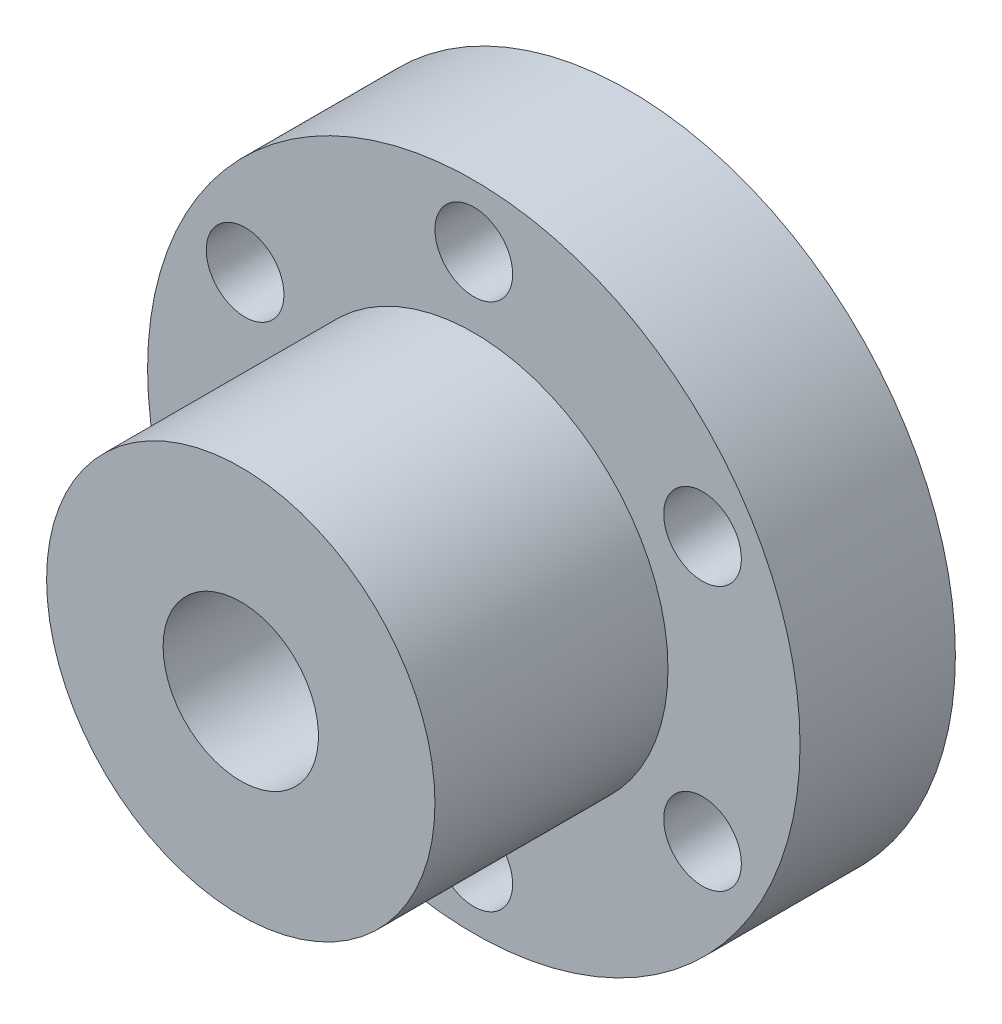
ISO-10303-21;
HEADER;
FILE_DESCRIPTION(('STEP AP214'),'2;1');
FILE_NAME('part.step','',(''),(''),'','','');
FILE_SCHEMA(('AUTOMOTIVE_DESIGN { 1 0 10303 214 1 1 1 1 }'));
ENDSEC;
DATA;
#1=APPLICATION_CONTEXT('core data for automotive mechanical design processes');
#2=APPLICATION_PROTOCOL_DEFINITION('international standard','automotive_design',2000,#1);
#3=PRODUCT_CONTEXT('',#1,'mechanical');
#4=PRODUCT('Part','Part','',(#3));
#5=PRODUCT_RELATED_PRODUCT_CATEGORY('part','',(#4));
#6=PRODUCT_DEFINITION_FORMATION('','',#4);
#7=PRODUCT_DEFINITION_CONTEXT('part definition',#1,'design');
#8=PRODUCT_DEFINITION('design','',#6,#7);
#9=PRODUCT_DEFINITION_SHAPE('','',#8);
#10=(LENGTH_UNIT() NAMED_UNIT(*) SI_UNIT(.MILLI.,.METRE.));
#11=(NAMED_UNIT(*) PLANE_ANGLE_UNIT() SI_UNIT($,.RADIAN.));
#12=(NAMED_UNIT(*) SI_UNIT($,.STERADIAN.) SOLID_ANGLE_UNIT());
#13=UNCERTAINTY_MEASURE_WITH_UNIT(LENGTH_MEASURE(1.E-05),#10,'distance_accuracy_value','');
#14=(GEOMETRIC_REPRESENTATION_CONTEXT(3) GLOBAL_UNCERTAINTY_ASSIGNED_CONTEXT((#13)) GLOBAL_UNIT_ASSIGNED_CONTEXT((#10,
#11,#12)) REPRESENTATION_CONTEXT('',''));
#15=CARTESIAN_POINT('',(0.,0.,0.));
#16=DIRECTION('',(0.,0.,1.));
#17=DIRECTION('',(1.,0.,0.));
#18=AXIS2_PLACEMENT_3D('',#15,#16,#17);
#19=CARTESIAN_POINT('',(0.,0.,10.));
#20=DIRECTION('',(0.,0.,-1.));
#21=DIRECTION('',(-1.,0.,0.));
#22=AXIS2_PLACEMENT_3D('',#19,#20,#21);
#23=CYLINDRICAL_SURFACE('',#22,21.);
#24=CARTESIAN_POINT('',(0.,0.,10.));
#25=DIRECTION('',(0.,0.,1.));
#26=DIRECTION('',(1.,0.,0.));
#27=AXIS2_PLACEMENT_3D('',#24,#25,#26);
#28=CIRCLE('',#27,21.);
#29=CARTESIAN_POINT('',(21.,0.,10.));
#30=VERTEX_POINT('',#29);
#31=EDGE_CURVE('E39',#30,#30,#28,.T.);
#32=ORIENTED_EDGE('',*,*,#31,.F.);
#33=EDGE_LOOP('',(#32));
#34=FACE_BOUND('',#33,.T.);
#35=CARTESIAN_POINT('',(0.,0.,0.));
#36=DIRECTION('',(0.,0.,1.));
#37=DIRECTION('',(1.,0.,0.));
#38=AXIS2_PLACEMENT_3D('',#35,#36,#37);
#39=CIRCLE('',#38,21.);
#40=CARTESIAN_POINT('',(21.,0.,0.));
#41=VERTEX_POINT('',#40);
#42=EDGE_CURVE('E44',#41,#41,#39,.T.);
#43=ORIENTED_EDGE('',*,*,#42,.T.);
#44=EDGE_LOOP('',(#43));
#45=FACE_BOUND('',#44,.T.);
#46=ADVANCED_FACE('F32',(#34,#45),#23,.T.);
#47=CARTESIAN_POINT('',(0.,0.,10.));
#48=DIRECTION('',(0.,0.,1.));
#49=DIRECTION('',(1.,0.,0.));
#50=AXIS2_PLACEMENT_3D('',#47,#48,#49);
#51=PLANE('',#50);
#52=CARTESIAN_POINT('',(-14.7224318643354,8.50000000000017,10.));
#53=DIRECTION('',(0.,0.,1.));
#54=DIRECTION('',(1.,0.,0.));
#55=AXIS2_PLACEMENT_3D('',#52,#53,#54);
#56=CIRCLE('',#55,2.5);
#57=CARTESIAN_POINT('',(-12.2224318643354,8.50000000000017,10.));
#58=VERTEX_POINT('',#57);
#59=EDGE_CURVE('E90',#58,#58,#56,.T.);
#60=ORIENTED_EDGE('',*,*,#59,.F.);
#61=EDGE_LOOP('',(#60));
#62=FACE_BOUND('',#61,.T.);
#63=CARTESIAN_POINT('',(-14.7224318643355,-8.49999999999986,10.));
#64=DIRECTION('',(0.,0.,1.));
#65=DIRECTION('',(1.,0.,0.));
#66=AXIS2_PLACEMENT_3D('',#63,#64,#65);
#67=CIRCLE('',#66,2.5);
#68=CARTESIAN_POINT('',(-12.2224318643355,-8.49999999999986,10.));
#69=VERTEX_POINT('',#68);
#70=EDGE_CURVE('E84',#69,#69,#67,.T.);
#71=ORIENTED_EDGE('',*,*,#70,.F.);
#72=EDGE_LOOP('',(#71));
#73=FACE_BOUND('',#72,.T.);
#74=CARTESIAN_POINT('',(0.,-17.,10.));
#75=DIRECTION('',(0.,0.,1.));
#76=DIRECTION('',(1.,0.,0.));
#77=AXIS2_PLACEMENT_3D('',#74,#75,#76);
#78=CIRCLE('',#77,2.5);
#79=CARTESIAN_POINT('',(2.5,-17.,10.));
#80=VERTEX_POINT('',#79);
#81=EDGE_CURVE('E78',#80,#80,#78,.T.);
#82=ORIENTED_EDGE('',*,*,#81,.F.);
#83=EDGE_LOOP('',(#82));
#84=FACE_BOUND('',#83,.T.);
#85=CARTESIAN_POINT('',(14.7224318643354,-8.50000000000007,10.));
#86=DIRECTION('',(0.,0.,1.));
#87=DIRECTION('',(1.,0.,0.));
#88=AXIS2_PLACEMENT_3D('',#85,#86,#87);
#89=CIRCLE('',#88,2.5);
#90=CARTESIAN_POINT('',(17.2224318643354,-8.50000000000007,10.));
#91=VERTEX_POINT('',#90);
#92=EDGE_CURVE('E72',#91,#91,#89,.T.);
#93=ORIENTED_EDGE('',*,*,#92,.F.);
#94=EDGE_LOOP('',(#93));
#95=FACE_BOUND('',#94,.T.);
#96=CARTESIAN_POINT('',(14.7224318643355,8.49999999999997,10.));
#97=DIRECTION('',(0.,0.,1.));
#98=DIRECTION('',(1.,0.,0.));
#99=AXIS2_PLACEMENT_3D('',#96,#97,#98);
#100=CIRCLE('',#99,2.5);
#101=CARTESIAN_POINT('',(17.2224318643355,8.49999999999997,10.));
#102=VERTEX_POINT('',#101);
#103=EDGE_CURVE('E66',#102,#102,#100,.T.);
#104=ORIENTED_EDGE('',*,*,#103,.F.);
#105=EDGE_LOOP('',(#104));
#106=FACE_BOUND('',#105,.T.);
#107=CARTESIAN_POINT('',(0.,17.,10.));
#108=DIRECTION('',(0.,0.,1.));
#109=DIRECTION('',(1.,0.,0.));
#110=AXIS2_PLACEMENT_3D('',#107,#108,#109);
#111=CIRCLE('',#110,2.5);
#112=CARTESIAN_POINT('',(2.5,17.,10.));
#113=VERTEX_POINT('',#112);
#114=EDGE_CURVE('E57',#113,#113,#111,.T.);
#115=ORIENTED_EDGE('',*,*,#114,.F.);
#116=EDGE_LOOP('',(#115));
#117=FACE_BOUND('',#116,.T.);
#118=CARTESIAN_POINT('',(0.,0.,10.));
#119=DIRECTION('',(0.,0.,1.));
#120=DIRECTION('',(1.,0.,0.));
#121=AXIS2_PLACEMENT_3D('',#118,#119,#120);
#122=CIRCLE('',#121,12.5);
#123=CARTESIAN_POINT('',(12.5,0.,10.));
#124=VERTEX_POINT('',#123);
#125=EDGE_CURVE('E10',#124,#124,#122,.T.);
#126=ORIENTED_EDGE('',*,*,#125,.F.);
#127=EDGE_LOOP('',(#126));
#128=FACE_BOUND('',#127,.T.);
#129=ORIENTED_EDGE('',*,*,#31,.T.);
#130=EDGE_LOOP('',(#129));
#131=FACE_BOUND('',#130,.T.);
#132=ADVANCED_FACE('F113',(#62,#73,#84,#95,#106,#117,#128,#131),#51,.T.);
#133=CARTESIAN_POINT('',(0.,0.,0.));
#134=DIRECTION('',(0.,0.,1.));
#135=DIRECTION('',(1.,0.,0.));
#136=AXIS2_PLACEMENT_3D('',#133,#134,#135);
#137=PLANE('',#136);
#138=CARTESIAN_POINT('',(0.,0.,0.));
#139=DIRECTION('',(0.,0.,1.));
#140=DIRECTION('',(1.,0.,0.));
#141=AXIS2_PLACEMENT_3D('',#138,#139,#140);
#142=CIRCLE('',#141,5.);
#143=CARTESIAN_POINT('',(-5.,0.,0.));
#144=VERTEX_POINT('',#143);
#145=EDGE_CURVE('E93',#144,#144,#142,.F.);
#146=ORIENTED_EDGE('',*,*,#145,.F.);
#147=EDGE_LOOP('',(#146));
#148=FACE_BOUND('',#147,.T.);
#149=CARTESIAN_POINT('',(-14.7224318643354,8.50000000000017,0.));
#150=DIRECTION('',(0.,0.,1.));
#151=DIRECTION('',(1.,0.,0.));
#152=AXIS2_PLACEMENT_3D('',#149,#150,#151);
#153=CIRCLE('',#152,2.5);
#154=CARTESIAN_POINT('',(-12.2224318643354,8.50000000000017,0.));
#155=VERTEX_POINT('',#154);
#156=EDGE_CURVE('E87',#155,#155,#153,.T.);
#157=ORIENTED_EDGE('',*,*,#156,.T.);
#158=EDGE_LOOP('',(#157));
#159=FACE_BOUND('',#158,.T.);
#160=CARTESIAN_POINT('',(-14.7224318643355,-8.49999999999986,0.));
#161=DIRECTION('',(0.,0.,1.));
#162=DIRECTION('',(1.,0.,0.));
#163=AXIS2_PLACEMENT_3D('',#160,#161,#162);
#164=CIRCLE('',#163,2.5);
#165=CARTESIAN_POINT('',(-12.2224318643355,-8.49999999999986,0.));
#166=VERTEX_POINT('',#165);
#167=EDGE_CURVE('E81',#166,#166,#164,.T.);
#168=ORIENTED_EDGE('',*,*,#167,.T.);
#169=EDGE_LOOP('',(#168));
#170=FACE_BOUND('',#169,.T.);
#171=CARTESIAN_POINT('',(0.,-17.,0.));
#172=DIRECTION('',(0.,0.,1.));
#173=DIRECTION('',(1.,0.,0.));
#174=AXIS2_PLACEMENT_3D('',#171,#172,#173);
#175=CIRCLE('',#174,2.5);
#176=CARTESIAN_POINT('',(2.5,-17.,0.));
#177=VERTEX_POINT('',#176);
#178=EDGE_CURVE('E75',#177,#177,#175,.T.);
#179=ORIENTED_EDGE('',*,*,#178,.T.);
#180=EDGE_LOOP('',(#179));
#181=FACE_BOUND('',#180,.T.);
#182=CARTESIAN_POINT('',(14.7224318643354,-8.50000000000007,0.));
#183=DIRECTION('',(0.,0.,1.));
#184=DIRECTION('',(1.,0.,0.));
#185=AXIS2_PLACEMENT_3D('',#182,#183,#184);
#186=CIRCLE('',#185,2.5);
#187=CARTESIAN_POINT('',(17.2224318643354,-8.50000000000007,0.));
#188=VERTEX_POINT('',#187);
#189=EDGE_CURVE('E69',#188,#188,#186,.T.);
#190=ORIENTED_EDGE('',*,*,#189,.T.);
#191=EDGE_LOOP('',(#190));
#192=FACE_BOUND('',#191,.T.);
#193=CARTESIAN_POINT('',(14.7224318643355,8.49999999999997,0.));
#194=DIRECTION('',(0.,0.,1.));
#195=DIRECTION('',(1.,0.,0.));
#196=AXIS2_PLACEMENT_3D('',#193,#194,#195);
#197=CIRCLE('',#196,2.5);
#198=CARTESIAN_POINT('',(17.2224318643355,8.49999999999997,0.));
#199=VERTEX_POINT('',#198);
#200=EDGE_CURVE('E61',#199,#199,#197,.T.);
#201=ORIENTED_EDGE('',*,*,#200,.T.);
#202=EDGE_LOOP('',(#201));
#203=FACE_BOUND('',#202,.T.);
#204=CARTESIAN_POINT('',(0.,17.,0.));
#205=DIRECTION('',(0.,0.,1.));
#206=DIRECTION('',(1.,0.,0.));
#207=AXIS2_PLACEMENT_3D('',#204,#205,#206);
#208=CIRCLE('',#207,2.5);
#209=CARTESIAN_POINT('',(2.5,17.,0.));
#210=VERTEX_POINT('',#209);
#211=EDGE_CURVE('E53',#210,#210,#208,.T.);
#212=ORIENTED_EDGE('',*,*,#211,.T.);
#213=EDGE_LOOP('',(#212));
#214=FACE_BOUND('',#213,.T.);
#215=ORIENTED_EDGE('',*,*,#42,.F.);
#216=EDGE_LOOP('',(#215));
#217=FACE_BOUND('',#216,.T.);
#218=ADVANCED_FACE('F118',(#148,#159,#170,#181,#192,#203,#214,#217),#137,.F.);
#219=CARTESIAN_POINT('',(0.,0.,25.));
#220=DIRECTION('',(0.,0.,-1.));
#221=DIRECTION('',(-1.,0.,0.));
#222=AXIS2_PLACEMENT_3D('',#219,#220,#221);
#223=CYLINDRICAL_SURFACE('',#222,12.5);
#224=CARTESIAN_POINT('',(0.,0.,25.));
#225=DIRECTION('',(0.,0.,1.));
#226=DIRECTION('',(1.,0.,0.));
#227=AXIS2_PLACEMENT_3D('',#224,#225,#226);
#228=CIRCLE('',#227,12.5);
#229=CARTESIAN_POINT('',(12.5,0.,25.));
#230=VERTEX_POINT('',#229);
#231=EDGE_CURVE('E47',#230,#230,#228,.T.);
#232=ORIENTED_EDGE('',*,*,#231,.F.);
#233=EDGE_LOOP('',(#232));
#234=FACE_BOUND('',#233,.T.);
#235=ORIENTED_EDGE('',*,*,#125,.T.);
#236=EDGE_LOOP('',(#235));
#237=FACE_BOUND('',#236,.T.);
#238=ADVANCED_FACE('F126',(#234,#237),#223,.T.);
#239=CARTESIAN_POINT('',(0.,0.,25.));
#240=DIRECTION('',(0.,0.,1.));
#241=DIRECTION('',(1.,0.,0.));
#242=AXIS2_PLACEMENT_3D('',#239,#240,#241);
#243=PLANE('',#242);
#244=CARTESIAN_POINT('',(0.,0.,25.));
#245=DIRECTION('',(0.,0.,1.));
#246=DIRECTION('',(1.,0.,0.));
#247=AXIS2_PLACEMENT_3D('',#244,#245,#246);
#248=CIRCLE('',#247,5.);
#249=CARTESIAN_POINT('',(-5.,0.,25.));
#250=VERTEX_POINT('',#249);
#251=EDGE_CURVE('E35',#250,#250,#248,.F.);
#252=ORIENTED_EDGE('',*,*,#251,.T.);
#253=EDGE_LOOP('',(#252));
#254=FACE_BOUND('',#253,.T.);
#255=ORIENTED_EDGE('',*,*,#231,.T.);
#256=EDGE_LOOP('',(#255));
#257=FACE_BOUND('',#256,.T.);
#258=ADVANCED_FACE('F100',(#254,#257),#243,.T.);
#259=CARTESIAN_POINT('',(0.,17.,10.));
#260=DIRECTION('',(0.,0.,1.));
#261=DIRECTION('',(1.,0.,0.));
#262=AXIS2_PLACEMENT_3D('',#259,#260,#261);
#263=CYLINDRICAL_SURFACE('',#262,2.5);
#264=ORIENTED_EDGE('',*,*,#211,.F.);
#265=EDGE_LOOP('',(#264));
#266=FACE_BOUND('',#265,.T.);
#267=ORIENTED_EDGE('',*,*,#114,.T.);
#268=EDGE_LOOP('',(#267));
#269=FACE_BOUND('',#268,.T.);
#270=ADVANCED_FACE('F136',(#266,#269),#263,.F.);
#271=CARTESIAN_POINT('',(14.7224318643355,8.49999999999997,10.));
#272=DIRECTION('',(0.,0.,1.));
#273=DIRECTION('',(1.,0.,0.));
#274=AXIS2_PLACEMENT_3D('',#271,#272,#273);
#275=CYLINDRICAL_SURFACE('',#274,2.5);
#276=ORIENTED_EDGE('',*,*,#200,.F.);
#277=EDGE_LOOP('',(#276));
#278=FACE_BOUND('',#277,.T.);
#279=ORIENTED_EDGE('',*,*,#103,.T.);
#280=EDGE_LOOP('',(#279));
#281=FACE_BOUND('',#280,.T.);
#282=ADVANCED_FACE('F139',(#278,#281),#275,.F.);
#283=CARTESIAN_POINT('',(14.7224318643354,-8.50000000000007,10.));
#284=DIRECTION('',(0.,0.,1.));
#285=DIRECTION('',(1.,0.,0.));
#286=AXIS2_PLACEMENT_3D('',#283,#284,#285);
#287=CYLINDRICAL_SURFACE('',#286,2.5);
#288=ORIENTED_EDGE('',*,*,#189,.F.);
#289=EDGE_LOOP('',(#288));
#290=FACE_BOUND('',#289,.T.);
#291=ORIENTED_EDGE('',*,*,#92,.T.);
#292=EDGE_LOOP('',(#291));
#293=FACE_BOUND('',#292,.T.);
#294=ADVANCED_FACE('F143',(#290,#293),#287,.F.);
#295=CARTESIAN_POINT('',(0.,-17.,10.));
#296=DIRECTION('',(0.,0.,1.));
#297=DIRECTION('',(1.,0.,0.));
#298=AXIS2_PLACEMENT_3D('',#295,#296,#297);
#299=CYLINDRICAL_SURFACE('',#298,2.5);
#300=ORIENTED_EDGE('',*,*,#178,.F.);
#301=EDGE_LOOP('',(#300));
#302=FACE_BOUND('',#301,.T.);
#303=ORIENTED_EDGE('',*,*,#81,.T.);
#304=EDGE_LOOP('',(#303));
#305=FACE_BOUND('',#304,.T.);
#306=ADVANCED_FACE('F147',(#302,#305),#299,.F.);
#307=CARTESIAN_POINT('',(-14.7224318643355,-8.49999999999986,10.));
#308=DIRECTION('',(0.,0.,1.));
#309=DIRECTION('',(1.,0.,0.));
#310=AXIS2_PLACEMENT_3D('',#307,#308,#309);
#311=CYLINDRICAL_SURFACE('',#310,2.5);
#312=ORIENTED_EDGE('',*,*,#167,.F.);
#313=EDGE_LOOP('',(#312));
#314=FACE_BOUND('',#313,.T.);
#315=ORIENTED_EDGE('',*,*,#70,.T.);
#316=EDGE_LOOP('',(#315));
#317=FACE_BOUND('',#316,.T.);
#318=ADVANCED_FACE('F109',(#314,#317),#311,.F.);
#319=CARTESIAN_POINT('',(-14.7224318643354,8.50000000000017,10.));
#320=DIRECTION('',(0.,0.,1.));
#321=DIRECTION('',(1.,0.,0.));
#322=AXIS2_PLACEMENT_3D('',#319,#320,#321);
#323=CYLINDRICAL_SURFACE('',#322,2.5);
#324=ORIENTED_EDGE('',*,*,#156,.F.);
#325=EDGE_LOOP('',(#324));
#326=FACE_BOUND('',#325,.T.);
#327=ORIENTED_EDGE('',*,*,#59,.T.);
#328=EDGE_LOOP('',(#327));
#329=FACE_BOUND('',#328,.T.);
#330=ADVANCED_FACE('F104',(#326,#329),#323,.F.);
#331=CARTESIAN_POINT('',(0.,0.,25.000012));
#332=DIRECTION('',(0.,0.,-1.));
#333=DIRECTION('',(-1.,0.,0.));
#334=AXIS2_PLACEMENT_3D('',#331,#332,#333);
#335=CYLINDRICAL_SURFACE('',#334,5.);
#336=CARTESIAN_POINT('',(-5.,0.,25.));
#337=CARTESIAN_POINT('',(-5.,0.,24.7395833333333));
#338=CARTESIAN_POINT('',(-5.,0.,24.4791666666667));
#339=CARTESIAN_POINT('',(-5.,0.,23.9583333333333));
#340=CARTESIAN_POINT('',(-5.,0.,23.6979166666667));
#341=CARTESIAN_POINT('',(-5.,0.,23.1770833333333));
#342=CARTESIAN_POINT('',(-5.,0.,22.9166666666667));
#343=CARTESIAN_POINT('',(-5.,0.,22.3958333333333));
#344=CARTESIAN_POINT('',(-5.,0.,22.1354166666667));
#345=CARTESIAN_POINT('',(-5.,0.,21.6145833333333));
#346=CARTESIAN_POINT('',(-5.,0.,21.3541666666667));
#347=CARTESIAN_POINT('',(-5.,0.,20.8333333333333));
#348=CARTESIAN_POINT('',(-5.,0.,20.5729166666667));
#349=CARTESIAN_POINT('',(-5.,0.,20.0520833333333));
#350=CARTESIAN_POINT('',(-5.,0.,19.7916666666667));
#351=CARTESIAN_POINT('',(-5.,0.,19.2708333333333));
#352=CARTESIAN_POINT('',(-5.,0.,19.0104166666667));
#353=CARTESIAN_POINT('',(-5.,0.,18.4895833333333));
#354=CARTESIAN_POINT('',(-5.,0.,18.2291666666667));
#355=CARTESIAN_POINT('',(-5.,0.,17.7083333333333));
#356=CARTESIAN_POINT('',(-5.,0.,17.4479166666667));
#357=CARTESIAN_POINT('',(-5.,0.,16.9270833333333));
#358=CARTESIAN_POINT('',(-5.,0.,16.6666666666667));
#359=CARTESIAN_POINT('',(-5.,0.,16.1458333333333));
#360=CARTESIAN_POINT('',(-5.,0.,15.8854166666667));
#361=CARTESIAN_POINT('',(-5.,0.,15.3645833333333));
#362=CARTESIAN_POINT('',(-5.,0.,15.1041666666667));
#363=CARTESIAN_POINT('',(-5.,0.,14.5833333333333));
#364=CARTESIAN_POINT('',(-5.,0.,14.3229166666667));
#365=CARTESIAN_POINT('',(-5.,0.,13.8020833333333));
#366=CARTESIAN_POINT('',(-5.,0.,13.5416666666667));
#367=CARTESIAN_POINT('',(-5.,0.,13.0208333333333));
#368=CARTESIAN_POINT('',(-5.,0.,12.7604166666667));
#369=CARTESIAN_POINT('',(-5.,0.,12.2395833333333));
#370=CARTESIAN_POINT('',(-5.,0.,11.9791666666667));
#371=CARTESIAN_POINT('',(-5.,0.,11.4583333333333));
#372=CARTESIAN_POINT('',(-5.,0.,11.1979166666667));
#373=CARTESIAN_POINT('',(-5.,0.,10.6770833333333));
#374=CARTESIAN_POINT('',(-5.,0.,10.4166666666667));
#375=CARTESIAN_POINT('',(-5.,0.,9.89583333333333));
#376=CARTESIAN_POINT('',(-5.,0.,9.63541666666667));
#377=CARTESIAN_POINT('',(-5.,0.,9.11458333333333));
#378=CARTESIAN_POINT('',(-5.,0.,8.85416666666666));
#379=CARTESIAN_POINT('',(-5.,0.,8.33333333333333));
#380=CARTESIAN_POINT('',(-5.,0.,8.07291666666666));
#381=CARTESIAN_POINT('',(-5.,0.,7.55208333333333));
#382=CARTESIAN_POINT('',(-5.,0.,7.29166666666667));
#383=CARTESIAN_POINT('',(-5.,0.,6.77083333333333));
#384=CARTESIAN_POINT('',(-5.,0.,6.51041666666667));
#385=CARTESIAN_POINT('',(-5.,0.,5.98958333333333));
#386=CARTESIAN_POINT('',(-5.,0.,5.72916666666666));
#387=CARTESIAN_POINT('',(-5.,0.,5.20833333333333));
#388=CARTESIAN_POINT('',(-5.,0.,4.94791666666666));
#389=CARTESIAN_POINT('',(-5.,0.,4.42708333333333));
#390=CARTESIAN_POINT('',(-5.,0.,4.16666666666666));
#391=CARTESIAN_POINT('',(-5.,0.,3.64583333333333));
#392=CARTESIAN_POINT('',(-5.,0.,3.38541666666666));
#393=CARTESIAN_POINT('',(-5.,0.,2.86458333333333));
#394=CARTESIAN_POINT('',(-5.,0.,2.60416666666666));
#395=CARTESIAN_POINT('',(-5.,0.,2.08333333333333));
#396=CARTESIAN_POINT('',(-5.,0.,1.82291666666666));
#397=CARTESIAN_POINT('',(-5.,0.,1.30208333333333));
#398=CARTESIAN_POINT('',(-5.,0.,1.04166666666666));
#399=CARTESIAN_POINT('',(-5.,0.,0.52083333333333));
#400=CARTESIAN_POINT('',(-5.,0.,0.260416666666664));
#401=CARTESIAN_POINT('',(-5.,0.,0.));
#402=B_SPLINE_CURVE_WITH_KNOTS('',3,(#336,#337,#338,#339,#340,#341,#342,#343,#344,#345,#346,
#347,#348,#349,#350,#351,#352,#353,#354,#355,#356,#357,#358,#359,#360,#361,#362,#363,#364,#365,
#366,#367,#368,#369,#370,#371,#372,#373,#374,#375,#376,#377,#378,#379,#380,#381,#382,#383,#384,
#385,#386,#387,#388,#389,#390,#391,#392,#393,#394,#395,#396,#397,#398,#399,#400,#401),
.UNSPECIFIED.,.F.,.F.,(4,2,2,2,2,2,2,2,2,2,2,2,2,2,2,2,2,2,2,2,2,2,2,2,2,2,2,2,2,2,2,2,4),(0.,
0.781249999999997,1.5625,2.34375,3.125,3.90625,4.6875,5.46875,6.25,7.03125,7.8125,8.59375,9.375,
10.15625,10.9375,11.71875,12.5,13.28125,14.0625,14.84375,15.625,16.40625,17.1875,17.96875,18.75,
19.53125,20.3125,21.09375,21.875,22.65625,23.4375,24.21875,25.),.UNSPECIFIED.);
#403=EDGE_CURVE('BSEAM102',#250,#144,#402,.T.);
#404=ORIENTED_EDGE('',*,*,#251,.F.);
#405=ORIENTED_EDGE('',*,*,#145,.T.);
#406=ORIENTED_EDGE('',*,*,#403,.T.);
#407=ORIENTED_EDGE('',*,*,#403,.F.);
#408=EDGE_LOOP('',(#404,#406,#405,#407));
#409=FACE_BOUND('',#408,.T.);
#410=ADVANCED_FACE('F102',(#409),#335,.F.);
#411=CLOSED_SHELL('',(#46,#132,#218,#238,#258,#270,#282,#294,#306,#318,#330,#410));
#412=MANIFOLD_SOLID_BREP('B2',#411);
#413=ADVANCED_BREP_SHAPE_REPRESENTATION('',(#18,#412),#14);
#414=SHAPE_DEFINITION_REPRESENTATION(#9,#413);
ENDSEC;
END-ISO-10303-21;
